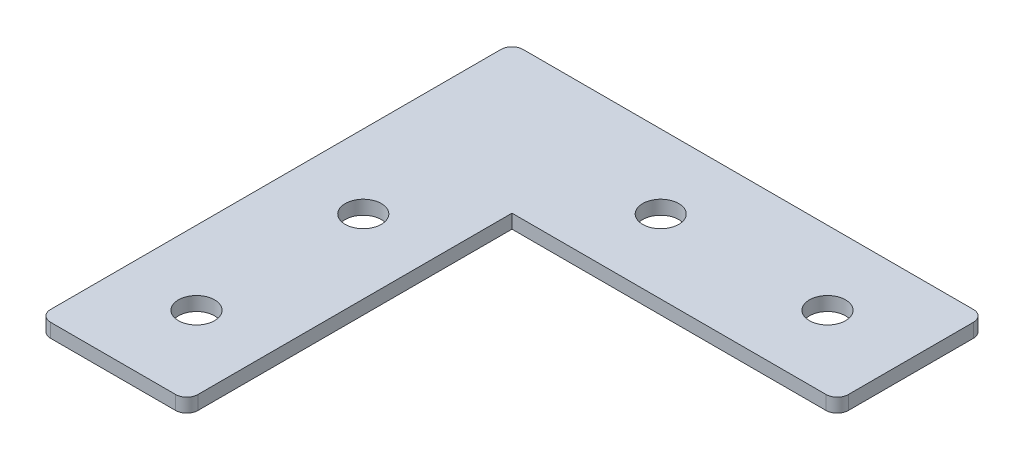
ISO-10303-21;
HEADER;
FILE_DESCRIPTION(('STEP AP214'),'2;1');
FILE_NAME('part.step','',(''),(''),'','','');
FILE_SCHEMA(('AUTOMOTIVE_DESIGN { 1 0 10303 214 1 1 1 1 }'));
ENDSEC;
DATA;
#1=APPLICATION_CONTEXT('core data for automotive mechanical design processes');
#2=APPLICATION_PROTOCOL_DEFINITION('international standard','automotive_design',2000,#1);
#3=PRODUCT_CONTEXT('',#1,'mechanical');
#4=PRODUCT('Part','Part','',(#3));
#5=PRODUCT_RELATED_PRODUCT_CATEGORY('part','',(#4));
#6=PRODUCT_DEFINITION_FORMATION('','',#4);
#7=PRODUCT_DEFINITION_CONTEXT('part definition',#1,'design');
#8=PRODUCT_DEFINITION('design','',#6,#7);
#9=PRODUCT_DEFINITION_SHAPE('','',#8);
#10=(LENGTH_UNIT() NAMED_UNIT(*) SI_UNIT(.MILLI.,.METRE.));
#11=(NAMED_UNIT(*) PLANE_ANGLE_UNIT() SI_UNIT($,.RADIAN.));
#12=(NAMED_UNIT(*) SI_UNIT($,.STERADIAN.) SOLID_ANGLE_UNIT());
#13=UNCERTAINTY_MEASURE_WITH_UNIT(LENGTH_MEASURE(1.E-05),#10,'distance_accuracy_value','');
#14=(GEOMETRIC_REPRESENTATION_CONTEXT(3) GLOBAL_UNCERTAINTY_ASSIGNED_CONTEXT((#13)) GLOBAL_UNIT_ASSIGNED_CONTEXT((#10,
#11,#12)) REPRESENTATION_CONTEXT('',''));
#15=CARTESIAN_POINT('',(0.,0.,0.));
#16=DIRECTION('',(0.,0.,1.));
#17=DIRECTION('',(1.,0.,0.));
#18=AXIS2_PLACEMENT_3D('',#15,#16,#17);
#19=CARTESIAN_POINT('',(0.,2.5,0.));
#20=DIRECTION('',(0.,0.,1.));
#21=DIRECTION('',(-1.,0.,0.));
#22=AXIS2_PLACEMENT_3D('',#19,#20,#21);
#23=PLANE('',#22);
#24=DIRECTION('',(1.,0.,0.));
#25=VECTOR('',#24,1.);
#26=CARTESIAN_POINT('',(0.,0.,0.));
#27=LINE('',#26,#25);
#28=CARTESIAN_POINT('',(2.,0.,0.));
#29=VERTEX_POINT('',#28);
#30=CARTESIAN_POINT('',(83.,0.,0.));
#31=VERTEX_POINT('',#30);
#32=EDGE_CURVE('E159',#29,#31,#27,.T.);
#33=ORIENTED_EDGE('',*,*,#32,.F.);
#34=DIRECTION('',(0.,-1.,0.));
#35=VECTOR('',#34,1.);
#36=CARTESIAN_POINT('',(2.,0.,0.));
#37=LINE('',#36,#35);
#38=CARTESIAN_POINT('',(2.,2.5,0.));
#39=VERTEX_POINT('',#38);
#40=EDGE_CURVE('E190',#39,#29,#37,.T.);
#41=ORIENTED_EDGE('',*,*,#40,.F.);
#42=DIRECTION('',(1.,0.,0.));
#43=VECTOR('',#42,1.);
#44=CARTESIAN_POINT('',(0.,2.5,0.));
#45=LINE('',#44,#43);
#46=CARTESIAN_POINT('',(83.,2.5,0.));
#47=VERTEX_POINT('',#46);
#48=EDGE_CURVE('E153',#39,#47,#45,.T.);
#49=ORIENTED_EDGE('',*,*,#48,.T.);
#50=DIRECTION('',(0.,-1.,0.));
#51=VECTOR('',#50,1.);
#52=CARTESIAN_POINT('',(83.,2.5,0.));
#53=LINE('',#52,#51);
#54=EDGE_CURVE('E193',#31,#47,#53,.F.);
#55=ORIENTED_EDGE('',*,*,#54,.F.);
#56=EDGE_LOOP('',(#33,#41,#49,#55));
#57=FACE_BOUND('',#56,.T.);
#58=ADVANCED_FACE('F41',(#57),#23,.F.);
#59=CARTESIAN_POINT('',(85.,2.5,0.));
#60=DIRECTION('',(-1.,0.,0.));
#61=DIRECTION('',(0.,0.,-1.));
#62=AXIS2_PLACEMENT_3D('',#59,#60,#61);
#63=PLANE('',#62);
#64=DIRECTION('',(0.,0.,1.));
#65=VECTOR('',#64,1.);
#66=CARTESIAN_POINT('',(85.,2.5,0.));
#67=LINE('',#66,#65);
#68=CARTESIAN_POINT('',(85.,2.5,2.));
#69=VERTEX_POINT('',#68);
#70=CARTESIAN_POINT('',(85.,2.5,24.5));
#71=VERTEX_POINT('',#70);
#72=EDGE_CURVE('E150',#69,#71,#67,.T.);
#73=ORIENTED_EDGE('',*,*,#72,.T.);
#74=DIRECTION('',(0.,-1.,0.));
#75=VECTOR('',#74,1.);
#76=CARTESIAN_POINT('',(85.,2.5,24.5));
#77=LINE('',#76,#75);
#78=CARTESIAN_POINT('',(85.,0.,24.5));
#79=VERTEX_POINT('',#78);
#80=EDGE_CURVE('E143',#79,#71,#77,.F.);
#81=ORIENTED_EDGE('',*,*,#80,.F.);
#82=DIRECTION('',(0.,0.,1.));
#83=VECTOR('',#82,1.);
#84=CARTESIAN_POINT('',(85.,0.,0.));
#85=LINE('',#84,#83);
#86=CARTESIAN_POINT('',(85.,0.,2.));
#87=VERTEX_POINT('',#86);
#88=EDGE_CURVE('E162',#87,#79,#85,.T.);
#89=ORIENTED_EDGE('',*,*,#88,.F.);
#90=DIRECTION('',(0.,-1.,0.));
#91=VECTOR('',#90,1.);
#92=CARTESIAN_POINT('',(85.,2.5,2.));
#93=LINE('',#92,#91);
#94=EDGE_CURVE('E177',#69,#87,#93,.T.);
#95=ORIENTED_EDGE('',*,*,#94,.F.);
#96=EDGE_LOOP('',(#73,#81,#89,#95));
#97=FACE_BOUND('',#96,.T.);
#98=ADVANCED_FACE('F232',(#97),#63,.F.);
#99=CARTESIAN_POINT('',(26.5,2.5,26.5));
#100=DIRECTION('',(0.,0.,1.));
#101=DIRECTION('',(-1.,0.,0.));
#102=AXIS2_PLACEMENT_3D('',#99,#100,#101);
#103=PLANE('',#102);
#104=DIRECTION('',(1.,0.,0.));
#105=VECTOR('',#104,1.);
#106=CARTESIAN_POINT('',(26.5,2.5,26.5));
#107=LINE('',#106,#105);
#108=CARTESIAN_POINT('',(26.5,2.5,26.5));
#109=VERTEX_POINT('',#108);
#110=CARTESIAN_POINT('',(83.,2.5,26.5));
#111=VERTEX_POINT('',#110);
#112=EDGE_CURVE('E128',#109,#111,#107,.T.);
#113=ORIENTED_EDGE('',*,*,#112,.F.);
#114=DIRECTION('',(0.,-1.,0.));
#115=VECTOR('',#114,1.);
#116=CARTESIAN_POINT('',(26.5,2.5,26.5));
#117=LINE('',#116,#115);
#118=CARTESIAN_POINT('',(26.5,0.,26.5));
#119=VERTEX_POINT('',#118);
#120=EDGE_CURVE('E136',#109,#119,#117,.T.);
#121=ORIENTED_EDGE('',*,*,#120,.T.);
#122=DIRECTION('',(1.,0.,0.));
#123=VECTOR('',#122,1.);
#124=CARTESIAN_POINT('',(26.5,0.,26.5));
#125=LINE('',#124,#123);
#126=CARTESIAN_POINT('',(83.,0.,26.5));
#127=VERTEX_POINT('',#126);
#128=EDGE_CURVE('E166',#119,#127,#125,.T.);
#129=ORIENTED_EDGE('',*,*,#128,.T.);
#130=DIRECTION('',(0.,-1.,0.));
#131=VECTOR('',#130,1.);
#132=CARTESIAN_POINT('',(83.,0.,26.5));
#133=LINE('',#132,#131);
#134=EDGE_CURVE('E149',#111,#127,#133,.T.);
#135=ORIENTED_EDGE('',*,*,#134,.F.);
#136=EDGE_LOOP('',(#113,#121,#129,#135));
#137=FACE_BOUND('',#136,.T.);
#138=ADVANCED_FACE('F147',(#137),#103,.T.);
#139=CARTESIAN_POINT('',(26.5,2.5,26.5));
#140=DIRECTION('',(-1.,0.,0.));
#141=DIRECTION('',(0.,0.,-1.));
#142=AXIS2_PLACEMENT_3D('',#139,#140,#141);
#143=PLANE('',#142);
#144=DIRECTION('',(0.,0.,1.));
#145=VECTOR('',#144,1.);
#146=CARTESIAN_POINT('',(26.5,0.,26.5));
#147=LINE('',#146,#145);
#148=CARTESIAN_POINT('',(26.5,0.,83.));
#149=VERTEX_POINT('',#148);
#150=EDGE_CURVE('E139',#119,#149,#147,.T.);
#151=ORIENTED_EDGE('',*,*,#150,.F.);
#152=ORIENTED_EDGE('',*,*,#120,.F.);
#153=DIRECTION('',(0.,0.,1.));
#154=VECTOR('',#153,1.);
#155=CARTESIAN_POINT('',(26.5,2.5,26.5));
#156=LINE('',#155,#154);
#157=CARTESIAN_POINT('',(26.5,2.5,83.));
#158=VERTEX_POINT('',#157);
#159=EDGE_CURVE('E124',#109,#158,#156,.T.);
#160=ORIENTED_EDGE('',*,*,#159,.T.);
#161=DIRECTION('',(0.,-1.,0.));
#162=VECTOR('',#161,1.);
#163=CARTESIAN_POINT('',(26.5,2.5,83.));
#164=LINE('',#163,#162);
#165=EDGE_CURVE('E11',#149,#158,#164,.F.);
#166=ORIENTED_EDGE('',*,*,#165,.F.);
#167=EDGE_LOOP('',(#151,#152,#160,#166));
#168=FACE_BOUND('',#167,.T.);
#169=ADVANCED_FACE('F137',(#168),#143,.F.);
#170=CARTESIAN_POINT('',(0.,2.5,85.));
#171=DIRECTION('',(0.,0.,1.));
#172=DIRECTION('',(-1.,0.,0.));
#173=AXIS2_PLACEMENT_3D('',#170,#171,#172);
#174=PLANE('',#173);
#175=DIRECTION('',(1.,0.,0.));
#176=VECTOR('',#175,1.);
#177=CARTESIAN_POINT('',(0.,0.,85.));
#178=LINE('',#177,#176);
#179=CARTESIAN_POINT('',(2.,0.,85.));
#180=VERTEX_POINT('',#179);
#181=CARTESIAN_POINT('',(24.5,0.,85.));
#182=VERTEX_POINT('',#181);
#183=EDGE_CURVE('E169',#180,#182,#178,.T.);
#184=ORIENTED_EDGE('',*,*,#183,.T.);
#185=DIRECTION('',(0.,-1.,0.));
#186=VECTOR('',#185,1.);
#187=CARTESIAN_POINT('',(24.5,0.,85.));
#188=LINE('',#187,#186);
#189=CARTESIAN_POINT('',(24.5,2.5,85.));
#190=VERTEX_POINT('',#189);
#191=EDGE_CURVE('E208',#190,#182,#188,.T.);
#192=ORIENTED_EDGE('',*,*,#191,.F.);
#193=DIRECTION('',(1.,0.,0.));
#194=VECTOR('',#193,1.);
#195=CARTESIAN_POINT('',(0.,2.5,85.));
#196=LINE('',#195,#194);
#197=CARTESIAN_POINT('',(2.,2.5,85.));
#198=VERTEX_POINT('',#197);
#199=EDGE_CURVE('E133',#198,#190,#196,.T.);
#200=ORIENTED_EDGE('',*,*,#199,.F.);
#201=DIRECTION('',(0.,-1.,0.));
#202=VECTOR('',#201,1.);
#203=CARTESIAN_POINT('',(2.,2.5,85.));
#204=LINE('',#203,#202);
#205=EDGE_CURVE('E49',#180,#198,#204,.F.);
#206=ORIENTED_EDGE('',*,*,#205,.F.);
#207=EDGE_LOOP('',(#184,#192,#200,#206));
#208=FACE_BOUND('',#207,.T.);
#209=ADVANCED_FACE('F216',(#208),#174,.T.);
#210=CARTESIAN_POINT('',(0.,2.5,0.));
#211=DIRECTION('',(-1.,0.,0.));
#212=DIRECTION('',(0.,0.,-1.));
#213=AXIS2_PLACEMENT_3D('',#210,#211,#212);
#214=PLANE('',#213);
#215=DIRECTION('',(0.,0.,1.));
#216=VECTOR('',#215,1.);
#217=CARTESIAN_POINT('',(0.,0.,0.));
#218=LINE('',#217,#216);
#219=CARTESIAN_POINT('',(0.,0.,2.));
#220=VERTEX_POINT('',#219);
#221=CARTESIAN_POINT('',(0.,0.,83.));
#222=VERTEX_POINT('',#221);
#223=EDGE_CURVE('E172',#220,#222,#218,.T.);
#224=ORIENTED_EDGE('',*,*,#223,.T.);
#225=DIRECTION('',(0.,-1.,0.));
#226=VECTOR('',#225,1.);
#227=CARTESIAN_POINT('',(0.,2.5,83.));
#228=LINE('',#227,#226);
#229=CARTESIAN_POINT('',(0.,2.5,83.));
#230=VERTEX_POINT('',#229);
#231=EDGE_CURVE('E204',#230,#222,#228,.T.);
#232=ORIENTED_EDGE('',*,*,#231,.F.);
#233=DIRECTION('',(0.,0.,1.));
#234=VECTOR('',#233,1.);
#235=CARTESIAN_POINT('',(0.,2.5,0.));
#236=LINE('',#235,#234);
#237=CARTESIAN_POINT('',(0.,2.5,2.));
#238=VERTEX_POINT('',#237);
#239=EDGE_CURVE('E144',#238,#230,#236,.T.);
#240=ORIENTED_EDGE('',*,*,#239,.F.);
#241=DIRECTION('',(0.,-1.,0.));
#242=VECTOR('',#241,1.);
#243=CARTESIAN_POINT('',(0.,2.5,2.));
#244=LINE('',#243,#242);
#245=EDGE_CURVE('E206',#220,#238,#244,.F.);
#246=ORIENTED_EDGE('',*,*,#245,.F.);
#247=EDGE_LOOP('',(#224,#232,#240,#246));
#248=FACE_BOUND('',#247,.T.);
#249=ADVANCED_FACE('F221',(#248),#214,.T.);
#250=CARTESIAN_POINT('',(0.,2.5,0.));
#251=DIRECTION('',(0.,1.,0.));
#252=DIRECTION('',(0.,0.,-1.));
#253=AXIS2_PLACEMENT_3D('',#250,#251,#252);
#254=PLANE('',#253);
#255=CARTESIAN_POINT('',(13.25,2.5,70.));
#256=DIRECTION('',(0.,-1.,0.));
#257=DIRECTION('',(0.,0.,-1.));
#258=AXIS2_PLACEMENT_3D('',#255,#256,#257);
#259=CIRCLE('',#258,3.25);
#260=CARTESIAN_POINT('',(13.25,2.5,66.75));
#261=VERTEX_POINT('',#260);
#262=EDGE_CURVE('E277',#261,#261,#259,.T.);
#263=ORIENTED_EDGE('',*,*,#262,.T.);
#264=EDGE_LOOP('',(#263));
#265=FACE_BOUND('',#264,.T.);
#266=CARTESIAN_POINT('',(40.,2.5,13.2499999999998));
#267=DIRECTION('',(0.,-1.,0.));
#268=DIRECTION('',(0.,0.,-1.));
#269=AXIS2_PLACEMENT_3D('',#266,#267,#268);
#270=CIRCLE('',#269,3.25000000000001);
#271=CARTESIAN_POINT('',(40.,2.5,9.99999999999978));
#272=VERTEX_POINT('',#271);
#273=EDGE_CURVE('E268',#272,#272,#270,.T.);
#274=ORIENTED_EDGE('',*,*,#273,.T.);
#275=EDGE_LOOP('',(#274));
#276=FACE_BOUND('',#275,.T.);
#277=CARTESIAN_POINT('',(13.2500000000003,2.5,40.));
#278=DIRECTION('',(0.,-1.,0.));
#279=DIRECTION('',(0.,0.,-1.));
#280=AXIS2_PLACEMENT_3D('',#277,#278,#279);
#281=CIRCLE('',#280,3.25);
#282=CARTESIAN_POINT('',(13.2500000000003,2.5,36.75));
#283=VERTEX_POINT('',#282);
#284=EDGE_CURVE('E267',#283,#283,#281,.T.);
#285=ORIENTED_EDGE('',*,*,#284,.T.);
#286=EDGE_LOOP('',(#285));
#287=FACE_BOUND('',#286,.T.);
#288=CARTESIAN_POINT('',(70.,2.5,13.25));
#289=DIRECTION('',(0.,-1.,0.));
#290=DIRECTION('',(0.,0.,-1.));
#291=AXIS2_PLACEMENT_3D('',#288,#289,#290);
#292=CIRCLE('',#291,3.25000000000001);
#293=CARTESIAN_POINT('',(70.,2.5,9.99999999999999));
#294=VERTEX_POINT('',#293);
#295=EDGE_CURVE('E274',#294,#294,#292,.T.);
#296=ORIENTED_EDGE('',*,*,#295,.T.);
#297=EDGE_LOOP('',(#296));
#298=FACE_BOUND('',#297,.T.);
#299=ORIENTED_EDGE('',*,*,#48,.F.);
#300=CARTESIAN_POINT('',(2.,2.5,2.));
#301=DIRECTION('',(0.,-1.,0.));
#302=DIRECTION('',(0.,0.,-1.));
#303=AXIS2_PLACEMENT_3D('',#300,#301,#302);
#304=CIRCLE('',#303,2.);
#305=EDGE_CURVE('E63',#238,#39,#304,.T.);
#306=ORIENTED_EDGE('',*,*,#305,.F.);
#307=ORIENTED_EDGE('',*,*,#239,.T.);
#308=CARTESIAN_POINT('',(2.,2.5,83.));
#309=DIRECTION('',(0.,-1.,0.));
#310=DIRECTION('',(0.,0.,-1.));
#311=AXIS2_PLACEMENT_3D('',#308,#309,#310);
#312=CIRCLE('',#311,2.);
#313=EDGE_CURVE('E56',#198,#230,#312,.T.);
#314=ORIENTED_EDGE('',*,*,#313,.F.);
#315=ORIENTED_EDGE('',*,*,#199,.T.);
#316=CARTESIAN_POINT('',(24.5,2.5,83.));
#317=DIRECTION('',(0.,-1.,0.));
#318=DIRECTION('',(0.,0.,-1.));
#319=AXIS2_PLACEMENT_3D('',#316,#317,#318);
#320=CIRCLE('',#319,2.);
#321=EDGE_CURVE('E130',#158,#190,#320,.T.);
#322=ORIENTED_EDGE('',*,*,#321,.F.);
#323=ORIENTED_EDGE('',*,*,#159,.F.);
#324=ORIENTED_EDGE('',*,*,#112,.T.);
#325=CARTESIAN_POINT('',(83.,2.5,24.5));
#326=DIRECTION('',(0.,-1.,0.));
#327=DIRECTION('',(0.,0.,-1.));
#328=AXIS2_PLACEMENT_3D('',#325,#326,#327);
#329=CIRCLE('',#328,2.);
#330=EDGE_CURVE('E199',#71,#111,#329,.T.);
#331=ORIENTED_EDGE('',*,*,#330,.F.);
#332=ORIENTED_EDGE('',*,*,#72,.F.);
#333=CARTESIAN_POINT('',(83.,2.5,2.));
#334=DIRECTION('',(0.,-1.,0.));
#335=DIRECTION('',(0.,0.,-1.));
#336=AXIS2_PLACEMENT_3D('',#333,#334,#335);
#337=CIRCLE('',#336,2.);
#338=EDGE_CURVE('E201',#47,#69,#337,.T.);
#339=ORIENTED_EDGE('',*,*,#338,.F.);
#340=EDGE_LOOP('',(#299,#306,#307,#314,#315,#322,#323,#324,#331,#332,#339));
#341=FACE_BOUND('',#340,.T.);
#342=ADVANCED_FACE('F126',(#265,#276,#287,#298,#341),#254,.T.);
#343=CARTESIAN_POINT('',(0.,0.,0.));
#344=DIRECTION('',(0.,1.,0.));
#345=DIRECTION('',(0.,0.,-1.));
#346=AXIS2_PLACEMENT_3D('',#343,#344,#345);
#347=PLANE('',#346);
#348=CARTESIAN_POINT('',(13.25,0.,70.));
#349=DIRECTION('',(0.,-1.,0.));
#350=DIRECTION('',(0.,0.,-1.));
#351=AXIS2_PLACEMENT_3D('',#348,#349,#350);
#352=CIRCLE('',#351,3.25);
#353=CARTESIAN_POINT('',(13.25,0.,66.75));
#354=VERTEX_POINT('',#353);
#355=EDGE_CURVE('E163',#354,#354,#352,.T.);
#356=ORIENTED_EDGE('',*,*,#355,.F.);
#357=EDGE_LOOP('',(#356));
#358=FACE_BOUND('',#357,.T.);
#359=CARTESIAN_POINT('',(40.,0.,13.2499999999998));
#360=DIRECTION('',(0.,-1.,0.));
#361=DIRECTION('',(0.,0.,-1.));
#362=AXIS2_PLACEMENT_3D('',#359,#360,#361);
#363=CIRCLE('',#362,3.25000000000001);
#364=CARTESIAN_POINT('',(40.,0.,9.99999999999978));
#365=VERTEX_POINT('',#364);
#366=EDGE_CURVE('E278',#365,#365,#363,.T.);
#367=ORIENTED_EDGE('',*,*,#366,.F.);
#368=EDGE_LOOP('',(#367));
#369=FACE_BOUND('',#368,.T.);
#370=CARTESIAN_POINT('',(13.2500000000003,0.,40.));
#371=DIRECTION('',(0.,-1.,0.));
#372=DIRECTION('',(0.,0.,-1.));
#373=AXIS2_PLACEMENT_3D('',#370,#371,#372);
#374=CIRCLE('',#373,3.25);
#375=CARTESIAN_POINT('',(13.2500000000003,0.,36.75));
#376=VERTEX_POINT('',#375);
#377=EDGE_CURVE('E264',#376,#376,#374,.T.);
#378=ORIENTED_EDGE('',*,*,#377,.F.);
#379=EDGE_LOOP('',(#378));
#380=FACE_BOUND('',#379,.T.);
#381=CARTESIAN_POINT('',(70.,0.,13.25));
#382=DIRECTION('',(0.,-1.,0.));
#383=DIRECTION('',(0.,0.,-1.));
#384=AXIS2_PLACEMENT_3D('',#381,#382,#383);
#385=CIRCLE('',#384,3.25000000000001);
#386=CARTESIAN_POINT('',(70.,0.,9.99999999999999));
#387=VERTEX_POINT('',#386);
#388=EDGE_CURVE('E271',#387,#387,#385,.T.);
#389=ORIENTED_EDGE('',*,*,#388,.F.);
#390=EDGE_LOOP('',(#389));
#391=FACE_BOUND('',#390,.T.);
#392=ORIENTED_EDGE('',*,*,#88,.T.);
#393=CARTESIAN_POINT('',(83.,0.,24.5));
#394=DIRECTION('',(0.,-1.,0.));
#395=DIRECTION('',(0.,0.,-1.));
#396=AXIS2_PLACEMENT_3D('',#393,#394,#395);
#397=CIRCLE('',#396,2.);
#398=EDGE_CURVE('E186',#127,#79,#397,.F.);
#399=ORIENTED_EDGE('',*,*,#398,.F.);
#400=ORIENTED_EDGE('',*,*,#128,.F.);
#401=ORIENTED_EDGE('',*,*,#150,.T.);
#402=CARTESIAN_POINT('',(24.5,0.,83.));
#403=DIRECTION('',(0.,-1.,0.));
#404=DIRECTION('',(0.,0.,-1.));
#405=AXIS2_PLACEMENT_3D('',#402,#403,#404);
#406=CIRCLE('',#405,2.);
#407=EDGE_CURVE('E180',#182,#149,#406,.F.);
#408=ORIENTED_EDGE('',*,*,#407,.F.);
#409=ORIENTED_EDGE('',*,*,#183,.F.);
#410=CARTESIAN_POINT('',(2.,0.,83.));
#411=DIRECTION('',(0.,-1.,0.));
#412=DIRECTION('',(0.,0.,-1.));
#413=AXIS2_PLACEMENT_3D('',#410,#411,#412);
#414=CIRCLE('',#413,2.);
#415=EDGE_CURVE('E182',#222,#180,#414,.F.);
#416=ORIENTED_EDGE('',*,*,#415,.F.);
#417=ORIENTED_EDGE('',*,*,#223,.F.);
#418=CARTESIAN_POINT('',(2.,0.,2.));
#419=DIRECTION('',(0.,-1.,0.));
#420=DIRECTION('',(0.,0.,-1.));
#421=AXIS2_PLACEMENT_3D('',#418,#419,#420);
#422=CIRCLE('',#421,2.);
#423=EDGE_CURVE('E184',#29,#220,#422,.F.);
#424=ORIENTED_EDGE('',*,*,#423,.F.);
#425=ORIENTED_EDGE('',*,*,#32,.T.);
#426=CARTESIAN_POINT('',(83.,0.,2.));
#427=DIRECTION('',(0.,-1.,0.));
#428=DIRECTION('',(0.,0.,-1.));
#429=AXIS2_PLACEMENT_3D('',#426,#427,#428);
#430=CIRCLE('',#429,2.);
#431=EDGE_CURVE('E188',#87,#31,#430,.F.);
#432=ORIENTED_EDGE('',*,*,#431,.F.);
#433=EDGE_LOOP('',(#392,#399,#400,#401,#408,#409,#416,#417,#424,#425,#432));
#434=FACE_BOUND('',#433,.T.);
#435=ADVANCED_FACE('F224',(#358,#369,#380,#391,#434),#347,.F.);
#436=CARTESIAN_POINT('',(70.,0.,13.25));
#437=DIRECTION('',(0.,1.,0.));
#438=DIRECTION('',(0.,0.,-1.));
#439=AXIS2_PLACEMENT_3D('',#436,#437,#438);
#440=CYLINDRICAL_SURFACE('',#439,3.25000000000001);
#441=ORIENTED_EDGE('',*,*,#388,.T.);
#442=EDGE_LOOP('',(#441));
#443=FACE_BOUND('',#442,.T.);
#444=ORIENTED_EDGE('',*,*,#295,.F.);
#445=EDGE_LOOP('',(#444));
#446=FACE_BOUND('',#445,.T.);
#447=ADVANCED_FACE('F292',(#443,#446),#440,.F.);
#448=CARTESIAN_POINT('',(13.2500000000003,0.,40.));
#449=DIRECTION('',(0.,1.,0.));
#450=DIRECTION('',(0.,0.,-1.));
#451=AXIS2_PLACEMENT_3D('',#448,#449,#450);
#452=CYLINDRICAL_SURFACE('',#451,3.25);
#453=ORIENTED_EDGE('',*,*,#377,.T.);
#454=EDGE_LOOP('',(#453));
#455=FACE_BOUND('',#454,.T.);
#456=ORIENTED_EDGE('',*,*,#284,.F.);
#457=EDGE_LOOP('',(#456));
#458=FACE_BOUND('',#457,.T.);
#459=ADVANCED_FACE('F302',(#455,#458),#452,.F.);
#460=CARTESIAN_POINT('',(40.,0.,13.2499999999998));
#461=DIRECTION('',(0.,1.,0.));
#462=DIRECTION('',(0.,0.,-1.));
#463=AXIS2_PLACEMENT_3D('',#460,#461,#462);
#464=CYLINDRICAL_SURFACE('',#463,3.25000000000001);
#465=ORIENTED_EDGE('',*,*,#366,.T.);
#466=EDGE_LOOP('',(#465));
#467=FACE_BOUND('',#466,.T.);
#468=ORIENTED_EDGE('',*,*,#273,.F.);
#469=EDGE_LOOP('',(#468));
#470=FACE_BOUND('',#469,.T.);
#471=ADVANCED_FACE('F368',(#467,#470),#464,.F.);
#472=CARTESIAN_POINT('',(13.25,0.,70.));
#473=DIRECTION('',(0.,1.,0.));
#474=DIRECTION('',(0.,0.,-1.));
#475=AXIS2_PLACEMENT_3D('',#472,#473,#474);
#476=CYLINDRICAL_SURFACE('',#475,3.25);
#477=ORIENTED_EDGE('',*,*,#355,.T.);
#478=EDGE_LOOP('',(#477));
#479=FACE_BOUND('',#478,.T.);
#480=ORIENTED_EDGE('',*,*,#262,.F.);
#481=EDGE_LOOP('',(#480));
#482=FACE_BOUND('',#481,.T.);
#483=ADVANCED_FACE('F247',(#479,#482),#476,.F.);
#484=CARTESIAN_POINT('',(83.,2.5,2.));
#485=DIRECTION('',(0.,-1.,0.));
#486=DIRECTION('',(0.,0.,1.));
#487=AXIS2_PLACEMENT_3D('',#484,#485,#486);
#488=CYLINDRICAL_SURFACE('',#487,2.);
#489=ORIENTED_EDGE('',*,*,#338,.T.);
#490=ORIENTED_EDGE('',*,*,#94,.T.);
#491=ORIENTED_EDGE('',*,*,#431,.T.);
#492=ORIENTED_EDGE('',*,*,#54,.T.);
#493=EDGE_LOOP('',(#489,#490,#491,#492));
#494=FACE_BOUND('',#493,.T.);
#495=ADVANCED_FACE('F243',(#494),#488,.T.);
#496=CARTESIAN_POINT('',(83.,2.5,24.5));
#497=DIRECTION('',(0.,1.,0.));
#498=DIRECTION('',(0.,0.,-1.));
#499=AXIS2_PLACEMENT_3D('',#496,#497,#498);
#500=CYLINDRICAL_SURFACE('',#499,2.);
#501=ORIENTED_EDGE('',*,*,#330,.T.);
#502=ORIENTED_EDGE('',*,*,#134,.T.);
#503=ORIENTED_EDGE('',*,*,#398,.T.);
#504=ORIENTED_EDGE('',*,*,#80,.T.);
#505=EDGE_LOOP('',(#501,#502,#503,#504));
#506=FACE_BOUND('',#505,.T.);
#507=ADVANCED_FACE('F246',(#506),#500,.T.);
#508=CARTESIAN_POINT('',(2.,2.5,2.));
#509=DIRECTION('',(0.,1.,0.));
#510=DIRECTION('',(0.,0.,-1.));
#511=AXIS2_PLACEMENT_3D('',#508,#509,#510);
#512=CYLINDRICAL_SURFACE('',#511,2.);
#513=ORIENTED_EDGE('',*,*,#305,.T.);
#514=ORIENTED_EDGE('',*,*,#40,.T.);
#515=ORIENTED_EDGE('',*,*,#423,.T.);
#516=ORIENTED_EDGE('',*,*,#245,.T.);
#517=EDGE_LOOP('',(#513,#514,#515,#516));
#518=FACE_BOUND('',#517,.T.);
#519=ADVANCED_FACE('F230',(#518),#512,.T.);
#520=CARTESIAN_POINT('',(2.,2.5,83.));
#521=DIRECTION('',(0.,-1.,0.));
#522=DIRECTION('',(0.,0.,1.));
#523=AXIS2_PLACEMENT_3D('',#520,#521,#522);
#524=CYLINDRICAL_SURFACE('',#523,2.);
#525=ORIENTED_EDGE('',*,*,#313,.T.);
#526=ORIENTED_EDGE('',*,*,#231,.T.);
#527=ORIENTED_EDGE('',*,*,#415,.T.);
#528=ORIENTED_EDGE('',*,*,#205,.T.);
#529=EDGE_LOOP('',(#525,#526,#527,#528));
#530=FACE_BOUND('',#529,.T.);
#531=ADVANCED_FACE('F212',(#530),#524,.T.);
#532=CARTESIAN_POINT('',(24.5,2.5,83.));
#533=DIRECTION('',(0.,1.,0.));
#534=DIRECTION('',(0.,0.,-1.));
#535=AXIS2_PLACEMENT_3D('',#532,#533,#534);
#536=CYLINDRICAL_SURFACE('',#535,2.);
#537=ORIENTED_EDGE('',*,*,#321,.T.);
#538=ORIENTED_EDGE('',*,*,#191,.T.);
#539=ORIENTED_EDGE('',*,*,#407,.T.);
#540=ORIENTED_EDGE('',*,*,#165,.T.);
#541=EDGE_LOOP('',(#537,#538,#539,#540));
#542=FACE_BOUND('',#541,.T.);
#543=ADVANCED_FACE('F43',(#542),#536,.T.);
#544=CLOSED_SHELL('',(#58,#98,#138,#169,#209,#249,#342,#435,#447,#459,#471,#483,#495,#507,#519,
#531,#543));
#545=MANIFOLD_SOLID_BREP('B2',#544);
#546=ADVANCED_BREP_SHAPE_REPRESENTATION('',(#18,#545),#14);
#547=SHAPE_DEFINITION_REPRESENTATION(#9,#546);
ENDSEC;
END-ISO-10303-21;
